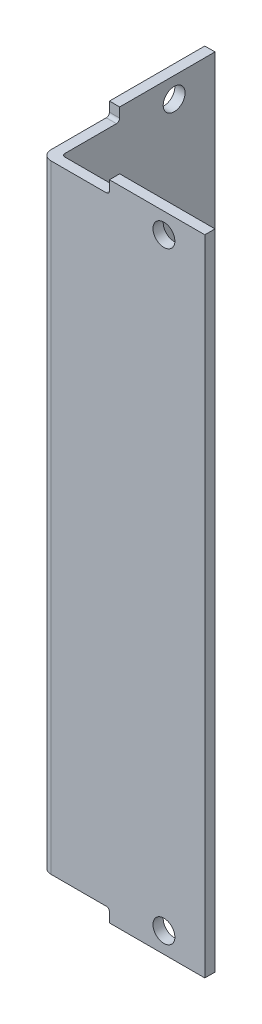
ISO-10303-21;
HEADER;
FILE_DESCRIPTION(('STEP AP214'),'2;1');
FILE_NAME('part.step','',(''),(''),'','','');
FILE_SCHEMA(('AUTOMOTIVE_DESIGN { 1 0 10303 214 1 1 1 1 }'));
ENDSEC;
DATA;
#1=APPLICATION_CONTEXT('core data for automotive mechanical design processes');
#2=APPLICATION_PROTOCOL_DEFINITION('international standard','automotive_design',2000,#1);
#3=PRODUCT_CONTEXT('',#1,'mechanical');
#4=PRODUCT('Part','Part','',(#3));
#5=PRODUCT_RELATED_PRODUCT_CATEGORY('part','',(#4));
#6=PRODUCT_DEFINITION_FORMATION('','',#4);
#7=PRODUCT_DEFINITION_CONTEXT('part definition',#1,'design');
#8=PRODUCT_DEFINITION('design','',#6,#7);
#9=PRODUCT_DEFINITION_SHAPE('','',#8);
#10=(LENGTH_UNIT() NAMED_UNIT(*) SI_UNIT(.MILLI.,.METRE.));
#11=(NAMED_UNIT(*) PLANE_ANGLE_UNIT() SI_UNIT($,.RADIAN.));
#12=(NAMED_UNIT(*) SI_UNIT($,.STERADIAN.) SOLID_ANGLE_UNIT());
#13=UNCERTAINTY_MEASURE_WITH_UNIT(LENGTH_MEASURE(1.E-05),#10,'distance_accuracy_value','');
#14=(GEOMETRIC_REPRESENTATION_CONTEXT(3) GLOBAL_UNCERTAINTY_ASSIGNED_CONTEXT((#13)) GLOBAL_UNIT_ASSIGNED_CONTEXT((#10,
#11,#12)) REPRESENTATION_CONTEXT('',''));
#15=CARTESIAN_POINT('',(0.,0.,0.));
#16=DIRECTION('',(0.,0.,1.));
#17=DIRECTION('',(1.,0.,0.));
#18=AXIS2_PLACEMENT_3D('',#15,#16,#17);
#19=CARTESIAN_POINT('',(-12.7,56.75,12.7));
#20=DIRECTION('',(1.,0.,0.));
#21=DIRECTION('',(0.,0.,-1.));
#22=AXIS2_PLACEMENT_3D('',#19,#20,#21);
#23=PLANE('',#22);
#24=CARTESIAN_POINT('',(-12.7,47.075,-6.35));
#25=DIRECTION('',(-1.,0.,0.));
#26=DIRECTION('',(0.,0.,1.));
#27=AXIS2_PLACEMENT_3D('',#24,#25,#26);
#28=CIRCLE('',#27,1.69999999999999);
#29=CARTESIAN_POINT('',(-12.7,47.075,-4.65));
#30=VERTEX_POINT('',#29);
#31=EDGE_CURVE('E260',#30,#30,#28,.T.);
#32=ORIENTED_EDGE('',*,*,#31,.F.);
#33=EDGE_LOOP('',(#32));
#34=FACE_BOUND('',#33,.T.);
#35=CARTESIAN_POINT('',(-12.7,-46.575,-6.35));
#36=DIRECTION('',(-1.,0.,0.));
#37=DIRECTION('',(0.,0.,1.));
#38=AXIS2_PLACEMENT_3D('',#35,#36,#37);
#39=CIRCLE('',#38,1.69999999999999);
#40=CARTESIAN_POINT('',(-12.7,-46.575,-4.65));
#41=VERTEX_POINT('',#40);
#42=EDGE_CURVE('E239',#41,#41,#39,.T.);
#43=ORIENTED_EDGE('',*,*,#42,.F.);
#44=EDGE_LOOP('',(#43));
#45=FACE_BOUND('',#44,.T.);
#46=DIRECTION('',(0.,-1.,0.));
#47=VECTOR('',#46,1.);
#48=CARTESIAN_POINT('',(-12.7,-47.75,2.1125));
#49=LINE('',#48,#47);
#50=CARTESIAN_POINT('',(-12.7,-48.25,2.1125));
#51=VERTEX_POINT('',#50);
#52=CARTESIAN_POINT('',(-12.7,-49.75,2.1125));
#53=VERTEX_POINT('',#52);
#54=EDGE_CURVE('E202',#51,#53,#49,.T.);
#55=ORIENTED_EDGE('',*,*,#54,.F.);
#56=CARTESIAN_POINT('',(-12.7,-48.25,2.6125));
#57=DIRECTION('',(1.,0.,0.));
#58=DIRECTION('',(0.,0.,-1.));
#59=AXIS2_PLACEMENT_3D('',#56,#57,#58);
#60=CIRCLE('',#59,0.5);
#61=CARTESIAN_POINT('',(-12.7,-47.75,2.6125));
#62=VERTEX_POINT('',#61);
#63=EDGE_CURVE('E52',#51,#62,#60,.T.);
#64=ORIENTED_EDGE('',*,*,#63,.T.);
#65=DIRECTION('',(0.,0.,1.));
#66=VECTOR('',#65,1.);
#67=CARTESIAN_POINT('',(-12.7,-47.75,12.7));
#68=LINE('',#67,#66);
#69=CARTESIAN_POINT('',(-12.7,-47.75,11.2));
#70=VERTEX_POINT('',#69);
#71=EDGE_CURVE('E211',#62,#70,#68,.T.);
#72=ORIENTED_EDGE('',*,*,#71,.T.);
#73=DIRECTION('',(0.,-1.,0.));
#74=VECTOR('',#73,1.);
#75=CARTESIAN_POINT('',(-12.7,56.75,11.2));
#76=LINE('',#75,#74);
#77=CARTESIAN_POINT('',(-12.7,48.250000046,11.2));
#78=VERTEX_POINT('',#77);
#79=EDGE_CURVE('E300',#70,#78,#76,.F.);
#80=ORIENTED_EDGE('',*,*,#79,.T.);
#81=DIRECTION('',(0.,0.,1.));
#82=VECTOR('',#81,1.);
#83=CARTESIAN_POINT('',(-12.7,48.250000046,12.7));
#84=LINE('',#83,#82);
#85=CARTESIAN_POINT('',(-12.7,48.250000046,2.6125));
#86=VERTEX_POINT('',#85);
#87=EDGE_CURVE('E372',#86,#78,#84,.T.);
#88=ORIENTED_EDGE('',*,*,#87,.F.);
#89=CARTESIAN_POINT('',(-12.7,48.750000046,2.6125));
#90=DIRECTION('',(1.,0.,0.));
#91=DIRECTION('',(0.,0.,-1.));
#92=AXIS2_PLACEMENT_3D('',#89,#90,#91);
#93=CIRCLE('',#92,0.5);
#94=CARTESIAN_POINT('',(-12.7,48.750000046,2.1125));
#95=VERTEX_POINT('',#94);
#96=EDGE_CURVE('E326',#86,#95,#93,.T.);
#97=ORIENTED_EDGE('',*,*,#96,.T.);
#98=DIRECTION('',(0.,1.,0.));
#99=VECTOR('',#98,1.);
#100=CARTESIAN_POINT('',(-12.7,48.250000046,2.1125));
#101=LINE('',#100,#99);
#102=CARTESIAN_POINT('',(-12.7,50.250000046,2.1125));
#103=VERTEX_POINT('',#102);
#104=EDGE_CURVE('E383',#95,#103,#101,.T.);
#105=ORIENTED_EDGE('',*,*,#104,.T.);
#106=DIRECTION('',(0.,0.,1.));
#107=VECTOR('',#106,1.);
#108=CARTESIAN_POINT('',(-12.7,50.250000046,-12.7));
#109=LINE('',#108,#107);
#110=CARTESIAN_POINT('',(-12.7,50.250000046,-12.7));
#111=VERTEX_POINT('',#110);
#112=EDGE_CURVE('E231',#111,#103,#109,.T.);
#113=ORIENTED_EDGE('',*,*,#112,.F.);
#114=DIRECTION('',(0.,-1.,0.));
#115=VECTOR('',#114,1.);
#116=CARTESIAN_POINT('',(-12.7,56.75,-12.7));
#117=LINE('',#116,#115);
#118=CARTESIAN_POINT('',(-12.7,-49.75,-12.7));
#119=VERTEX_POINT('',#118);
#120=EDGE_CURVE('E282',#111,#119,#117,.T.);
#121=ORIENTED_EDGE('',*,*,#120,.T.);
#122=DIRECTION('',(0.,0.,-1.));
#123=VECTOR('',#122,1.);
#124=CARTESIAN_POINT('',(-12.7,-49.75,-12.7));
#125=LINE('',#124,#123);
#126=EDGE_CURVE('E244',#53,#119,#125,.T.);
#127=ORIENTED_EDGE('',*,*,#126,.F.);
#128=EDGE_LOOP('',(#55,#64,#72,#80,#88,#97,#105,#113,#121,#127));
#129=FACE_BOUND('',#128,.T.);
#130=ADVANCED_FACE('F44',(#34,#45,#129),#23,.F.);
#131=CARTESIAN_POINT('',(-12.7,56.75,12.7));
#132=DIRECTION('',(0.,0.,-1.));
#133=DIRECTION('',(-1.,0.,0.));
#134=AXIS2_PLACEMENT_3D('',#131,#132,#133);
#135=PLANE('',#134);
#136=CARTESIAN_POINT('',(6.34999999999999,47.075,12.7));
#137=DIRECTION('',(0.,0.,1.));
#138=DIRECTION('',(1.,0.,0.));
#139=AXIS2_PLACEMENT_3D('',#136,#137,#138);
#140=CIRCLE('',#139,1.7);
#141=CARTESIAN_POINT('',(8.04999999999999,47.075,12.7));
#142=VERTEX_POINT('',#141);
#143=EDGE_CURVE('E266',#142,#142,#140,.T.);
#144=ORIENTED_EDGE('',*,*,#143,.F.);
#145=EDGE_LOOP('',(#144));
#146=FACE_BOUND('',#145,.T.);
#147=CARTESIAN_POINT('',(6.34999999999999,-46.575,12.7));
#148=DIRECTION('',(0.,0.,1.));
#149=DIRECTION('',(1.,0.,0.));
#150=AXIS2_PLACEMENT_3D('',#147,#148,#149);
#151=CIRCLE('',#150,1.7);
#152=CARTESIAN_POINT('',(8.04999999999999,-46.575,12.7));
#153=VERTEX_POINT('',#152);
#154=EDGE_CURVE('E254',#153,#153,#151,.T.);
#155=ORIENTED_EDGE('',*,*,#154,.F.);
#156=EDGE_LOOP('',(#155));
#157=FACE_BOUND('',#156,.T.);
#158=DIRECTION('',(1.,0.,0.));
#159=VECTOR('',#158,1.);
#160=CARTESIAN_POINT('',(-12.7,-47.75,12.7));
#161=LINE('',#160,#159);
#162=CARTESIAN_POINT('',(-11.2,-47.75,12.7));
#163=VERTEX_POINT('',#162);
#164=CARTESIAN_POINT('',(-2.6125,-47.75,12.7));
#165=VERTEX_POINT('',#164);
#166=EDGE_CURVE('E354',#163,#165,#161,.T.);
#167=ORIENTED_EDGE('',*,*,#166,.T.);
#168=CARTESIAN_POINT('',(-2.6125,-48.25,12.7));
#169=DIRECTION('',(0.,0.,-1.));
#170=DIRECTION('',(-1.,0.,0.));
#171=AXIS2_PLACEMENT_3D('',#168,#169,#170);
#172=CIRCLE('',#171,0.5);
#173=CARTESIAN_POINT('',(-2.1125,-48.25,12.7));
#174=VERTEX_POINT('',#173);
#175=EDGE_CURVE('E197',#165,#174,#172,.T.);
#176=ORIENTED_EDGE('',*,*,#175,.T.);
#177=DIRECTION('',(0.,-1.,0.));
#178=VECTOR('',#177,1.);
#179=CARTESIAN_POINT('',(-2.1125,-47.75,12.7));
#180=LINE('',#179,#178);
#181=CARTESIAN_POINT('',(-2.1125,-49.75,12.7));
#182=VERTEX_POINT('',#181);
#183=EDGE_CURVE('E189',#174,#182,#180,.T.);
#184=ORIENTED_EDGE('',*,*,#183,.T.);
#185=DIRECTION('',(-1.,0.,0.));
#186=VECTOR('',#185,1.);
#187=CARTESIAN_POINT('',(12.7,-49.75,12.7));
#188=LINE('',#187,#186);
#189=CARTESIAN_POINT('',(12.7,-49.75,12.7));
#190=VERTEX_POINT('',#189);
#191=EDGE_CURVE('E195',#190,#182,#188,.T.);
#192=ORIENTED_EDGE('',*,*,#191,.F.);
#193=DIRECTION('',(0.,-1.,0.));
#194=VECTOR('',#193,1.);
#195=CARTESIAN_POINT('',(12.7,56.75,12.7));
#196=LINE('',#195,#194);
#197=CARTESIAN_POINT('',(12.7,50.25,12.7));
#198=VERTEX_POINT('',#197);
#199=EDGE_CURVE('E277',#198,#190,#196,.T.);
#200=ORIENTED_EDGE('',*,*,#199,.F.);
#201=DIRECTION('',(1.,0.,0.));
#202=VECTOR('',#201,1.);
#203=CARTESIAN_POINT('',(12.7,50.25,12.7));
#204=LINE('',#203,#202);
#205=CARTESIAN_POINT('',(-2.1125,50.25,12.7));
#206=VERTEX_POINT('',#205);
#207=EDGE_CURVE('E399',#206,#198,#204,.T.);
#208=ORIENTED_EDGE('',*,*,#207,.F.);
#209=DIRECTION('',(0.,1.,0.));
#210=VECTOR('',#209,1.);
#211=CARTESIAN_POINT('',(-2.1125,48.250000046,12.7));
#212=LINE('',#211,#210);
#213=CARTESIAN_POINT('',(-2.1125,48.750000046,12.7));
#214=VERTEX_POINT('',#213);
#215=EDGE_CURVE('E379',#214,#206,#212,.T.);
#216=ORIENTED_EDGE('',*,*,#215,.F.);
#217=CARTESIAN_POINT('',(-2.6125,48.750000046,12.7));
#218=DIRECTION('',(0.,0.,-1.));
#219=DIRECTION('',(-1.,0.,0.));
#220=AXIS2_PLACEMENT_3D('',#217,#218,#219);
#221=CIRCLE('',#220,0.5);
#222=CARTESIAN_POINT('',(-2.6125,48.250000046,12.7));
#223=VERTEX_POINT('',#222);
#224=EDGE_CURVE('E323',#214,#223,#221,.T.);
#225=ORIENTED_EDGE('',*,*,#224,.T.);
#226=DIRECTION('',(1.,0.,0.));
#227=VECTOR('',#226,1.);
#228=CARTESIAN_POINT('',(-12.7,48.250000046,12.7));
#229=LINE('',#228,#227);
#230=CARTESIAN_POINT('',(-11.2,48.250000046,12.7));
#231=VERTEX_POINT('',#230);
#232=EDGE_CURVE('E375',#231,#223,#229,.T.);
#233=ORIENTED_EDGE('',*,*,#232,.F.);
#234=DIRECTION('',(0.,-1.,0.));
#235=VECTOR('',#234,1.);
#236=CARTESIAN_POINT('',(-11.2,56.75,12.7));
#237=LINE('',#236,#235);
#238=EDGE_CURVE('E293',#231,#163,#237,.T.);
#239=ORIENTED_EDGE('',*,*,#238,.T.);
#240=EDGE_LOOP('',(#167,#176,#184,#192,#200,#208,#216,#225,#233,#239));
#241=FACE_BOUND('',#240,.T.);
#242=ADVANCED_FACE('F192',(#146,#157,#241),#135,.F.);
#243=CARTESIAN_POINT('',(12.7,-56.75,11.1125));
#244=DIRECTION('',(0.,0.,1.));
#245=DIRECTION('',(1.,0.,0.));
#246=AXIS2_PLACEMENT_3D('',#243,#244,#245);
#247=PLANE('',#246);
#248=CARTESIAN_POINT('',(6.34999999999999,47.075,11.1125));
#249=DIRECTION('',(0.,0.,1.));
#250=DIRECTION('',(1.,0.,0.));
#251=AXIS2_PLACEMENT_3D('',#248,#249,#250);
#252=CIRCLE('',#251,1.69999999999999);
#253=CARTESIAN_POINT('',(8.04999999999999,47.075,11.1125));
#254=VERTEX_POINT('',#253);
#255=EDGE_CURVE('E270',#254,#254,#252,.T.);
#256=ORIENTED_EDGE('',*,*,#255,.T.);
#257=EDGE_LOOP('',(#256));
#258=FACE_BOUND('',#257,.T.);
#259=CARTESIAN_POINT('',(6.34999999999999,-46.575,11.1125));
#260=DIRECTION('',(0.,0.,1.));
#261=DIRECTION('',(1.,0.,0.));
#262=AXIS2_PLACEMENT_3D('',#259,#260,#261);
#263=CIRCLE('',#262,1.69999999999999);
#264=CARTESIAN_POINT('',(8.04999999999999,-46.575,11.1125));
#265=VERTEX_POINT('',#264);
#266=EDGE_CURVE('E257',#265,#265,#263,.T.);
#267=ORIENTED_EDGE('',*,*,#266,.T.);
#268=EDGE_LOOP('',(#267));
#269=FACE_BOUND('',#268,.T.);
#270=DIRECTION('',(0.,-1.,0.));
#271=VECTOR('',#270,1.);
#272=CARTESIAN_POINT('',(-2.1125,-56.75,11.1125));
#273=LINE('',#272,#271);
#274=CARTESIAN_POINT('',(-2.1125,-48.25,11.1125));
#275=VERTEX_POINT('',#274);
#276=CARTESIAN_POINT('',(-2.1125,-49.75,11.1125));
#277=VERTEX_POINT('',#276);
#278=EDGE_CURVE('E208',#275,#277,#273,.T.);
#279=ORIENTED_EDGE('',*,*,#278,.F.);
#280=CARTESIAN_POINT('',(-2.6125,-48.25,11.1125));
#281=DIRECTION('',(0.,0.,1.));
#282=DIRECTION('',(1.,0.,0.));
#283=AXIS2_PLACEMENT_3D('',#280,#281,#282);
#284=CIRCLE('',#283,0.5);
#285=CARTESIAN_POINT('',(-2.6125,-47.75,11.1125));
#286=VERTEX_POINT('',#285);
#287=EDGE_CURVE('E343',#275,#286,#284,.T.);
#288=ORIENTED_EDGE('',*,*,#287,.T.);
#289=DIRECTION('',(-1.,0.,0.));
#290=VECTOR('',#289,1.);
#291=CARTESIAN_POINT('',(12.7,-47.75,11.1125));
#292=LINE('',#291,#290);
#293=CARTESIAN_POINT('',(-10.6045,-47.75,11.1125));
#294=VERTEX_POINT('',#293);
#295=EDGE_CURVE('E369',#286,#294,#292,.T.);
#296=ORIENTED_EDGE('',*,*,#295,.T.);
#297=DIRECTION('',(0.,1.,0.));
#298=VECTOR('',#297,1.);
#299=CARTESIAN_POINT('',(-10.6045,56.75,11.1125));
#300=LINE('',#299,#298);
#301=CARTESIAN_POINT('',(-10.6045,48.250000046,11.1125));
#302=VERTEX_POINT('',#301);
#303=EDGE_CURVE('E286',#294,#302,#300,.T.);
#304=ORIENTED_EDGE('',*,*,#303,.T.);
#305=DIRECTION('',(1.,0.,0.));
#306=VECTOR('',#305,1.);
#307=CARTESIAN_POINT('',(12.7,48.250000046,11.1125));
#308=LINE('',#307,#306);
#309=CARTESIAN_POINT('',(-2.6125,48.250000046,11.1125));
#310=VERTEX_POINT('',#309);
#311=EDGE_CURVE('E217',#302,#310,#308,.T.);
#312=ORIENTED_EDGE('',*,*,#311,.T.);
#313=CARTESIAN_POINT('',(-2.6125,48.750000046,11.1125));
#314=DIRECTION('',(0.,0.,1.));
#315=DIRECTION('',(1.,0.,0.));
#316=AXIS2_PLACEMENT_3D('',#313,#314,#315);
#317=CIRCLE('',#316,0.5);
#318=CARTESIAN_POINT('',(-2.1125,48.750000046,11.1125));
#319=VERTEX_POINT('',#318);
#320=EDGE_CURVE('E320',#310,#319,#317,.T.);
#321=ORIENTED_EDGE('',*,*,#320,.T.);
#322=DIRECTION('',(0.,1.,0.));
#323=VECTOR('',#322,1.);
#324=CARTESIAN_POINT('',(-2.1125,-56.75,11.1125));
#325=LINE('',#324,#323);
#326=CARTESIAN_POINT('',(-2.1125,50.250000046,11.1125));
#327=VERTEX_POINT('',#326);
#328=EDGE_CURVE('E385',#319,#327,#325,.T.);
#329=ORIENTED_EDGE('',*,*,#328,.T.);
#330=DIRECTION('',(-1.,0.,0.));
#331=VECTOR('',#330,1.);
#332=CARTESIAN_POINT('',(12.7,50.25,11.1125));
#333=LINE('',#332,#331);
#334=CARTESIAN_POINT('',(12.7,50.25,11.1125));
#335=VERTEX_POINT('',#334);
#336=EDGE_CURVE('E230',#335,#327,#333,.T.);
#337=ORIENTED_EDGE('',*,*,#336,.F.);
#338=DIRECTION('',(0.,1.,0.));
#339=VECTOR('',#338,1.);
#340=CARTESIAN_POINT('',(12.7,-56.75,11.1125));
#341=LINE('',#340,#339);
#342=CARTESIAN_POINT('',(12.7,-49.75,11.1125));
#343=VERTEX_POINT('',#342);
#344=EDGE_CURVE('E275',#343,#335,#341,.T.);
#345=ORIENTED_EDGE('',*,*,#344,.F.);
#346=DIRECTION('',(1.,0.,0.));
#347=VECTOR('',#346,1.);
#348=CARTESIAN_POINT('',(12.7,-49.75,11.1125));
#349=LINE('',#348,#347);
#350=EDGE_CURVE('E219',#277,#343,#349,.T.);
#351=ORIENTED_EDGE('',*,*,#350,.F.);
#352=EDGE_LOOP('',(#279,#288,#296,#304,#312,#321,#329,#337,#345,#351));
#353=FACE_BOUND('',#352,.T.);
#354=ADVANCED_FACE('F423',(#258,#269,#353),#247,.F.);
#355=CARTESIAN_POINT('',(-11.1125,-56.75,-12.7));
#356=DIRECTION('',(-1.,0.,0.));
#357=DIRECTION('',(0.,0.,1.));
#358=AXIS2_PLACEMENT_3D('',#355,#356,#357);
#359=PLANE('',#358);
#360=CARTESIAN_POINT('',(-11.1125,47.075,-6.35));
#361=DIRECTION('',(-1.,0.,0.));
#362=DIRECTION('',(0.,0.,1.));
#363=AXIS2_PLACEMENT_3D('',#360,#361,#362);
#364=CIRCLE('',#363,1.69999999999999);
#365=CARTESIAN_POINT('',(-11.1125,47.075,-4.65));
#366=VERTEX_POINT('',#365);
#367=EDGE_CURVE('E263',#366,#366,#364,.T.);
#368=ORIENTED_EDGE('',*,*,#367,.T.);
#369=EDGE_LOOP('',(#368));
#370=FACE_BOUND('',#369,.T.);
#371=CARTESIAN_POINT('',(-11.1125,-46.575,-6.35));
#372=DIRECTION('',(-1.,0.,0.));
#373=DIRECTION('',(0.,0.,1.));
#374=AXIS2_PLACEMENT_3D('',#371,#372,#373);
#375=CIRCLE('',#374,1.69999999999999);
#376=CARTESIAN_POINT('',(-11.1125,-46.575,-4.65));
#377=VERTEX_POINT('',#376);
#378=EDGE_CURVE('E253',#377,#377,#375,.T.);
#379=ORIENTED_EDGE('',*,*,#378,.T.);
#380=EDGE_LOOP('',(#379));
#381=FACE_BOUND('',#380,.T.);
#382=DIRECTION('',(0.,1.,0.));
#383=VECTOR('',#382,1.);
#384=CARTESIAN_POINT('',(-11.1125,-56.75,2.1125));
#385=LINE('',#384,#383);
#386=CARTESIAN_POINT('',(-11.1125,-49.75,2.1125));
#387=VERTEX_POINT('',#386);
#388=CARTESIAN_POINT('',(-11.1125,-48.25,2.1125));
#389=VERTEX_POINT('',#388);
#390=EDGE_CURVE('E201',#387,#389,#385,.T.);
#391=ORIENTED_EDGE('',*,*,#390,.F.);
#392=DIRECTION('',(0.,0.,1.));
#393=VECTOR('',#392,1.);
#394=CARTESIAN_POINT('',(-11.1125,-49.75,-12.7));
#395=LINE('',#394,#393);
#396=CARTESIAN_POINT('',(-11.1125,-49.75,-12.7));
#397=VERTEX_POINT('',#396);
#398=EDGE_CURVE('E240',#397,#387,#395,.T.);
#399=ORIENTED_EDGE('',*,*,#398,.F.);
#400=DIRECTION('',(0.,1.,0.));
#401=VECTOR('',#400,1.);
#402=CARTESIAN_POINT('',(-11.1125,-56.75,-12.7));
#403=LINE('',#402,#401);
#404=CARTESIAN_POINT('',(-11.1125,50.250000046,-12.7));
#405=VERTEX_POINT('',#404);
#406=EDGE_CURVE('E274',#397,#405,#403,.T.);
#407=ORIENTED_EDGE('',*,*,#406,.T.);
#408=DIRECTION('',(0.,0.,-1.));
#409=VECTOR('',#408,1.);
#410=CARTESIAN_POINT('',(-11.1125,50.250000046,-12.7));
#411=LINE('',#410,#409);
#412=CARTESIAN_POINT('',(-11.1125,50.250000046,2.1125));
#413=VERTEX_POINT('',#412);
#414=EDGE_CURVE('E237',#413,#405,#411,.T.);
#415=ORIENTED_EDGE('',*,*,#414,.F.);
#416=DIRECTION('',(0.,-1.,0.));
#417=VECTOR('',#416,1.);
#418=CARTESIAN_POINT('',(-11.1125,-56.75,2.1125));
#419=LINE('',#418,#417);
#420=CARTESIAN_POINT('',(-11.1125,48.750000046,2.1125));
#421=VERTEX_POINT('',#420);
#422=EDGE_CURVE('E390',#413,#421,#419,.T.);
#423=ORIENTED_EDGE('',*,*,#422,.T.);
#424=CARTESIAN_POINT('',(-11.1125,48.750000046,2.6125));
#425=DIRECTION('',(-1.,0.,0.));
#426=DIRECTION('',(0.,0.,1.));
#427=AXIS2_PLACEMENT_3D('',#424,#425,#426);
#428=CIRCLE('',#427,0.5);
#429=CARTESIAN_POINT('',(-11.1125,48.250000046,2.6125));
#430=VERTEX_POINT('',#429);
#431=EDGE_CURVE('E328',#421,#430,#428,.T.);
#432=ORIENTED_EDGE('',*,*,#431,.T.);
#433=DIRECTION('',(0.,0.,1.));
#434=VECTOR('',#433,1.);
#435=CARTESIAN_POINT('',(-11.1125,48.250000046,-12.7));
#436=LINE('',#435,#434);
#437=CARTESIAN_POINT('',(-11.1125,48.250000046,10.6045));
#438=VERTEX_POINT('',#437);
#439=EDGE_CURVE('E223',#430,#438,#436,.T.);
#440=ORIENTED_EDGE('',*,*,#439,.T.);
#441=DIRECTION('',(0.,1.,0.));
#442=VECTOR('',#441,1.);
#443=CARTESIAN_POINT('',(-11.1125,-56.75,10.6045));
#444=LINE('',#443,#442);
#445=CARTESIAN_POINT('',(-11.1125,-47.75,10.6045));
#446=VERTEX_POINT('',#445);
#447=EDGE_CURVE('E289',#438,#446,#444,.F.);
#448=ORIENTED_EDGE('',*,*,#447,.T.);
#449=DIRECTION('',(0.,0.,-1.));
#450=VECTOR('',#449,1.);
#451=CARTESIAN_POINT('',(-11.1125,-47.75,-12.7));
#452=LINE('',#451,#450);
#453=CARTESIAN_POINT('',(-11.1125,-47.75,2.6125));
#454=VERTEX_POINT('',#453);
#455=EDGE_CURVE('E367',#446,#454,#452,.T.);
#456=ORIENTED_EDGE('',*,*,#455,.T.);
#457=CARTESIAN_POINT('',(-11.1125,-48.25,2.6125));
#458=DIRECTION('',(-1.,0.,0.));
#459=DIRECTION('',(0.,0.,1.));
#460=AXIS2_PLACEMENT_3D('',#457,#458,#459);
#461=CIRCLE('',#460,0.5);
#462=EDGE_CURVE('E11',#454,#389,#461,.T.);
#463=ORIENTED_EDGE('',*,*,#462,.T.);
#464=EDGE_LOOP('',(#391,#399,#407,#415,#423,#432,#440,#448,#456,#463));
#465=FACE_BOUND('',#464,.T.);
#466=ADVANCED_FACE('F452',(#370,#381,#465),#359,.F.);
#467=CARTESIAN_POINT('',(12.701,-49.75,-12.7));
#468=DIRECTION('',(0.,1.,0.));
#469=DIRECTION('',(0.,0.,1.));
#470=AXIS2_PLACEMENT_3D('',#467,#468,#469);
#471=PLANE('',#470);
#472=DIRECTION('',(0.,0.,-1.));
#473=VECTOR('',#472,1.);
#474=CARTESIAN_POINT('',(-2.1125,-49.75,12.7));
#475=LINE('',#474,#473);
#476=EDGE_CURVE('E205',#182,#277,#475,.T.);
#477=ORIENTED_EDGE('',*,*,#476,.T.);
#478=ORIENTED_EDGE('',*,*,#350,.T.);
#479=DIRECTION('',(0.,0.,1.));
#480=VECTOR('',#479,1.);
#481=CARTESIAN_POINT('',(12.7,-49.75,-12.701));
#482=LINE('',#481,#480);
#483=EDGE_CURVE('E216',#343,#190,#482,.T.);
#484=ORIENTED_EDGE('',*,*,#483,.T.);
#485=ORIENTED_EDGE('',*,*,#191,.T.);
#486=EDGE_LOOP('',(#477,#478,#484,#485));
#487=FACE_BOUND('',#486,.T.);
#488=ADVANCED_FACE('F214',(#487),#471,.F.);
#489=DIRECTION('',(1.,0.,0.));
#490=VECTOR('',#489,1.);
#491=CARTESIAN_POINT('',(12.701,-49.75,2.1125));
#492=LINE('',#491,#490);
#493=EDGE_CURVE('E330',#53,#387,#492,.T.);
#494=ORIENTED_EDGE('',*,*,#493,.F.);
#495=ORIENTED_EDGE('',*,*,#126,.T.);
#496=DIRECTION('',(-1.,0.,0.));
#497=VECTOR('',#496,1.);
#498=CARTESIAN_POINT('',(12.701,-49.75,-12.7));
#499=LINE('',#498,#497);
#500=EDGE_CURVE('E235',#397,#119,#499,.T.);
#501=ORIENTED_EDGE('',*,*,#500,.F.);
#502=ORIENTED_EDGE('',*,*,#398,.T.);
#503=EDGE_LOOP('',(#494,#495,#501,#502));
#504=FACE_BOUND('',#503,.T.);
#505=ADVANCED_FACE('F451',(#504),#471,.F.);
#506=CARTESIAN_POINT('',(12.701,50.250000046,-12.7));
#507=DIRECTION('',(0.,-1.,0.));
#508=DIRECTION('',(0.,0.,-1.));
#509=AXIS2_PLACEMENT_3D('',#506,#507,#508);
#510=PLANE('',#509);
#511=ORIENTED_EDGE('',*,*,#112,.T.);
#512=DIRECTION('',(1.,0.,0.));
#513=VECTOR('',#512,1.);
#514=CARTESIAN_POINT('',(12.701,50.250000046,2.1125));
#515=LINE('',#514,#513);
#516=EDGE_CURVE('E303',#103,#413,#515,.T.);
#517=ORIENTED_EDGE('',*,*,#516,.T.);
#518=ORIENTED_EDGE('',*,*,#414,.T.);
#519=DIRECTION('',(-1.,0.,0.));
#520=VECTOR('',#519,1.);
#521=CARTESIAN_POINT('',(12.701,50.250000046,-12.7));
#522=LINE('',#521,#520);
#523=EDGE_CURVE('E234',#405,#111,#522,.T.);
#524=ORIENTED_EDGE('',*,*,#523,.T.);
#525=EDGE_LOOP('',(#511,#517,#518,#524));
#526=FACE_BOUND('',#525,.T.);
#527=ADVANCED_FACE('F444',(#526),#510,.F.);
#528=CARTESIAN_POINT('',(12.7,56.75,12.7));
#529=DIRECTION('',(-1.,0.,0.));
#530=DIRECTION('',(0.,0.,1.));
#531=AXIS2_PLACEMENT_3D('',#528,#529,#530);
#532=PLANE('',#531);
#533=ORIENTED_EDGE('',*,*,#344,.T.);
#534=DIRECTION('',(0.,0.,1.));
#535=VECTOR('',#534,1.);
#536=CARTESIAN_POINT('',(12.7,50.25,-12.701));
#537=LINE('',#536,#535);
#538=EDGE_CURVE('E226',#335,#198,#537,.T.);
#539=ORIENTED_EDGE('',*,*,#538,.T.);
#540=ORIENTED_EDGE('',*,*,#199,.T.);
#541=ORIENTED_EDGE('',*,*,#483,.F.);
#542=EDGE_LOOP('',(#533,#539,#540,#541));
#543=FACE_BOUND('',#542,.T.);
#544=ADVANCED_FACE('F407',(#543),#532,.F.);
#545=CARTESIAN_POINT('',(-12.7,56.75,-12.7));
#546=DIRECTION('',(0.,0.,1.));
#547=DIRECTION('',(1.,0.,0.));
#548=AXIS2_PLACEMENT_3D('',#545,#546,#547);
#549=PLANE('',#548);
#550=ORIENTED_EDGE('',*,*,#523,.F.);
#551=ORIENTED_EDGE('',*,*,#406,.F.);
#552=ORIENTED_EDGE('',*,*,#500,.T.);
#553=ORIENTED_EDGE('',*,*,#120,.F.);
#554=EDGE_LOOP('',(#550,#551,#552,#553));
#555=FACE_BOUND('',#554,.T.);
#556=ADVANCED_FACE('F448',(#555),#549,.F.);
#557=CARTESIAN_POINT('',(-10.6045,-56.75,10.6045));
#558=DIRECTION('',(0.,-1.,0.));
#559=DIRECTION('',(0.,0.,-1.));
#560=AXIS2_PLACEMENT_3D('',#557,#558,#559);
#561=CYLINDRICAL_SURFACE('',#560,0.508);
#562=ORIENTED_EDGE('',*,*,#303,.F.);
#563=CARTESIAN_POINT('',(-10.6045,-47.75,10.6045));
#564=DIRECTION('',(0.,1.,0.));
#565=DIRECTION('',(0.,0.,1.));
#566=AXIS2_PLACEMENT_3D('',#563,#564,#565);
#567=CIRCLE('',#566,0.508);
#568=EDGE_CURVE('E361',#294,#446,#567,.F.);
#569=ORIENTED_EDGE('',*,*,#568,.T.);
#570=ORIENTED_EDGE('',*,*,#447,.F.);
#571=CARTESIAN_POINT('',(-10.6045,48.250000046,10.6045));
#572=DIRECTION('',(0.,-1.,0.));
#573=DIRECTION('',(0.,0.,-1.));
#574=AXIS2_PLACEMENT_3D('',#571,#572,#573);
#575=CIRCLE('',#574,0.508);
#576=EDGE_CURVE('E393',#438,#302,#575,.F.);
#577=ORIENTED_EDGE('',*,*,#576,.T.);
#578=EDGE_LOOP('',(#562,#569,#570,#577));
#579=FACE_BOUND('',#578,.T.);
#580=ADVANCED_FACE('F428',(#579),#561,.F.);
#581=CARTESIAN_POINT('',(6.34999999999999,47.075,12.7));
#582=DIRECTION('',(0.,0.,1.));
#583=DIRECTION('',(1.,0.,0.));
#584=AXIS2_PLACEMENT_3D('',#581,#582,#583);
#585=CYLINDRICAL_SURFACE('',#584,1.69999999999999);
#586=ORIENTED_EDGE('',*,*,#143,.T.);
#587=EDGE_LOOP('',(#586));
#588=FACE_BOUND('',#587,.T.);
#589=ORIENTED_EDGE('',*,*,#255,.F.);
#590=EDGE_LOOP('',(#589));
#591=FACE_BOUND('',#590,.T.);
#592=ADVANCED_FACE('F481',(#588,#591),#585,.F.);
#593=CARTESIAN_POINT('',(-12.7,47.075,-6.35));
#594=DIRECTION('',(-1.,0.,0.));
#595=DIRECTION('',(0.,0.,1.));
#596=AXIS2_PLACEMENT_3D('',#593,#594,#595);
#597=CYLINDRICAL_SURFACE('',#596,1.69999999999999);
#598=ORIENTED_EDGE('',*,*,#31,.T.);
#599=EDGE_LOOP('',(#598));
#600=FACE_BOUND('',#599,.T.);
#601=ORIENTED_EDGE('',*,*,#367,.F.);
#602=EDGE_LOOP('',(#601));
#603=FACE_BOUND('',#602,.T.);
#604=ADVANCED_FACE('F517',(#600,#603),#597,.F.);
#605=CARTESIAN_POINT('',(6.34999999999999,-46.575,12.7));
#606=DIRECTION('',(0.,0.,1.));
#607=DIRECTION('',(1.,0.,0.));
#608=AXIS2_PLACEMENT_3D('',#605,#606,#607);
#609=CYLINDRICAL_SURFACE('',#608,1.69999999999999);
#610=ORIENTED_EDGE('',*,*,#154,.T.);
#611=EDGE_LOOP('',(#610));
#612=FACE_BOUND('',#611,.T.);
#613=ORIENTED_EDGE('',*,*,#266,.F.);
#614=EDGE_LOOP('',(#613));
#615=FACE_BOUND('',#614,.T.);
#616=ADVANCED_FACE('F513',(#612,#615),#609,.F.);
#617=CARTESIAN_POINT('',(-12.7,-46.575,-6.35));
#618=DIRECTION('',(-1.,0.,0.));
#619=DIRECTION('',(0.,0.,1.));
#620=AXIS2_PLACEMENT_3D('',#617,#618,#619);
#621=CYLINDRICAL_SURFACE('',#620,1.69999999999999);
#622=ORIENTED_EDGE('',*,*,#42,.T.);
#623=EDGE_LOOP('',(#622));
#624=FACE_BOUND('',#623,.T.);
#625=ORIENTED_EDGE('',*,*,#378,.F.);
#626=EDGE_LOOP('',(#625));
#627=FACE_BOUND('',#626,.T.);
#628=ADVANCED_FACE('F486',(#624,#627),#621,.F.);
#629=CARTESIAN_POINT('',(-11.2,56.75,11.2));
#630=DIRECTION('',(0.,-1.,0.));
#631=DIRECTION('',(0.,0.,-1.));
#632=AXIS2_PLACEMENT_3D('',#629,#630,#631);
#633=CYLINDRICAL_SURFACE('',#632,1.5);
#634=CARTESIAN_POINT('',(-11.2,-47.75,11.2));
#635=DIRECTION('',(0.,1.,0.));
#636=DIRECTION('',(0.,0.,1.));
#637=AXIS2_PLACEMENT_3D('',#634,#635,#636);
#638=CIRCLE('',#637,1.5);
#639=EDGE_CURVE('E332',#163,#70,#638,.F.);
#640=ORIENTED_EDGE('',*,*,#639,.F.);
#641=ORIENTED_EDGE('',*,*,#238,.F.);
#642=CARTESIAN_POINT('',(-11.2,48.250000046,11.2));
#643=DIRECTION('',(0.,-1.,0.));
#644=DIRECTION('',(0.,0.,-1.));
#645=AXIS2_PLACEMENT_3D('',#642,#643,#644);
#646=CIRCLE('',#645,1.5);
#647=EDGE_CURVE('E306',#78,#231,#646,.F.);
#648=ORIENTED_EDGE('',*,*,#647,.F.);
#649=ORIENTED_EDGE('',*,*,#79,.F.);
#650=EDGE_LOOP('',(#640,#641,#648,#649));
#651=FACE_BOUND('',#650,.T.);
#652=ADVANCED_FACE('F482',(#651),#633,.T.);
#653=ORIENTED_EDGE('',*,*,#336,.T.);
#654=DIRECTION('',(0.,0.,-1.));
#655=VECTOR('',#654,1.);
#656=CARTESIAN_POINT('',(-2.1125,50.250000046,12.7));
#657=LINE('',#656,#655);
#658=EDGE_CURVE('E371',#206,#327,#657,.T.);
#659=ORIENTED_EDGE('',*,*,#658,.F.);
#660=ORIENTED_EDGE('',*,*,#207,.T.);
#661=ORIENTED_EDGE('',*,*,#538,.F.);
#662=EDGE_LOOP('',(#653,#659,#660,#661));
#663=FACE_BOUND('',#662,.T.);
#664=ADVANCED_FACE('F485',(#663),#510,.F.);
#665=CARTESIAN_POINT('',(0.,48.250000046,0.));
#666=DIRECTION('',(0.,-1.,0.));
#667=DIRECTION('',(0.,0.,-1.));
#668=AXIS2_PLACEMENT_3D('',#665,#666,#667);
#669=PLANE('',#668);
#670=ORIENTED_EDGE('',*,*,#232,.T.);
#671=DIRECTION('',(0.,0.,-1.));
#672=VECTOR('',#671,1.);
#673=CARTESIAN_POINT('',(-2.6125,48.250000046,11.1125));
#674=LINE('',#673,#672);
#675=EDGE_CURVE('E311',#223,#310,#674,.T.);
#676=ORIENTED_EDGE('',*,*,#675,.T.);
#677=ORIENTED_EDGE('',*,*,#311,.F.);
#678=ORIENTED_EDGE('',*,*,#576,.F.);
#679=ORIENTED_EDGE('',*,*,#439,.F.);
#680=DIRECTION('',(-1.,0.,0.));
#681=VECTOR('',#680,1.);
#682=CARTESIAN_POINT('',(-12.7,48.250000046,2.6125));
#683=LINE('',#682,#681);
#684=EDGE_CURVE('E308',#430,#86,#683,.T.);
#685=ORIENTED_EDGE('',*,*,#684,.T.);
#686=ORIENTED_EDGE('',*,*,#87,.T.);
#687=ORIENTED_EDGE('',*,*,#647,.T.);
#688=EDGE_LOOP('',(#670,#676,#677,#678,#679,#685,#686,#687));
#689=FACE_BOUND('',#688,.T.);
#690=ADVANCED_FACE('F420',(#689),#669,.F.);
#691=CARTESIAN_POINT('',(-12.7,48.250000046,2.1125));
#692=DIRECTION('',(0.,0.,-1.));
#693=DIRECTION('',(-1.,0.,0.));
#694=AXIS2_PLACEMENT_3D('',#691,#692,#693);
#695=PLANE('',#694);
#696=ORIENTED_EDGE('',*,*,#104,.F.);
#697=DIRECTION('',(-1.,0.,0.));
#698=VECTOR('',#697,1.);
#699=CARTESIAN_POINT('',(-11.1125,48.750000046,2.1125));
#700=LINE('',#699,#698);
#701=EDGE_CURVE('E318',#95,#421,#700,.F.);
#702=ORIENTED_EDGE('',*,*,#701,.T.);
#703=ORIENTED_EDGE('',*,*,#422,.F.);
#704=ORIENTED_EDGE('',*,*,#516,.F.);
#705=EDGE_LOOP('',(#696,#702,#703,#704));
#706=FACE_BOUND('',#705,.T.);
#707=ADVANCED_FACE('F441',(#706),#695,.F.);
#708=CARTESIAN_POINT('',(-2.1125,48.250000046,12.7));
#709=DIRECTION('',(1.,0.,0.));
#710=DIRECTION('',(0.,0.,-1.));
#711=AXIS2_PLACEMENT_3D('',#708,#709,#710);
#712=PLANE('',#711);
#713=ORIENTED_EDGE('',*,*,#328,.F.);
#714=DIRECTION('',(0.,0.,-1.));
#715=VECTOR('',#714,1.);
#716=CARTESIAN_POINT('',(-2.1125,48.750000046,12.7));
#717=LINE('',#716,#715);
#718=EDGE_CURVE('E315',#319,#214,#717,.F.);
#719=ORIENTED_EDGE('',*,*,#718,.T.);
#720=ORIENTED_EDGE('',*,*,#215,.T.);
#721=ORIENTED_EDGE('',*,*,#658,.T.);
#722=EDGE_LOOP('',(#713,#719,#720,#721));
#723=FACE_BOUND('',#722,.T.);
#724=ADVANCED_FACE('F490',(#723),#712,.F.);
#725=CARTESIAN_POINT('',(-2.6125,48.750000046,0.));
#726=DIRECTION('',(0.,0.,1.));
#727=DIRECTION('',(1.,0.,0.));
#728=AXIS2_PLACEMENT_3D('',#725,#726,#727);
#729=CYLINDRICAL_SURFACE('',#728,0.5);
#730=ORIENTED_EDGE('',*,*,#224,.F.);
#731=ORIENTED_EDGE('',*,*,#718,.F.);
#732=ORIENTED_EDGE('',*,*,#320,.F.);
#733=ORIENTED_EDGE('',*,*,#675,.F.);
#734=EDGE_LOOP('',(#730,#731,#732,#733));
#735=FACE_BOUND('',#734,.T.);
#736=ADVANCED_FACE('F417',(#735),#729,.F.);
#737=CARTESIAN_POINT('',(0.,48.750000046,2.6125));
#738=DIRECTION('',(1.,0.,0.));
#739=DIRECTION('',(0.,0.,-1.));
#740=AXIS2_PLACEMENT_3D('',#737,#738,#739);
#741=CYLINDRICAL_SURFACE('',#740,0.5);
#742=ORIENTED_EDGE('',*,*,#431,.F.);
#743=ORIENTED_EDGE('',*,*,#701,.F.);
#744=ORIENTED_EDGE('',*,*,#96,.F.);
#745=ORIENTED_EDGE('',*,*,#684,.F.);
#746=EDGE_LOOP('',(#742,#743,#744,#745));
#747=FACE_BOUND('',#746,.T.);
#748=ADVANCED_FACE('F435',(#747),#741,.F.);
#749=CARTESIAN_POINT('',(0.,-47.75,0.));
#750=DIRECTION('',(0.,1.,0.));
#751=DIRECTION('',(0.,0.,-1.));
#752=AXIS2_PLACEMENT_3D('',#749,#750,#751);
#753=PLANE('',#752);
#754=ORIENTED_EDGE('',*,*,#295,.F.);
#755=DIRECTION('',(0.,0.,-1.));
#756=VECTOR('',#755,1.);
#757=CARTESIAN_POINT('',(-2.6125,-47.75,0.));
#758=LINE('',#757,#756);
#759=EDGE_CURVE('E339',#286,#165,#758,.F.);
#760=ORIENTED_EDGE('',*,*,#759,.T.);
#761=ORIENTED_EDGE('',*,*,#166,.F.);
#762=ORIENTED_EDGE('',*,*,#639,.T.);
#763=ORIENTED_EDGE('',*,*,#71,.F.);
#764=DIRECTION('',(-1.,0.,0.));
#765=VECTOR('',#764,1.);
#766=CARTESIAN_POINT('',(0.,-47.75,2.6125));
#767=LINE('',#766,#765);
#768=EDGE_CURVE('E337',#62,#454,#767,.F.);
#769=ORIENTED_EDGE('',*,*,#768,.T.);
#770=ORIENTED_EDGE('',*,*,#455,.F.);
#771=ORIENTED_EDGE('',*,*,#568,.F.);
#772=EDGE_LOOP('',(#754,#760,#761,#762,#763,#769,#770,#771));
#773=FACE_BOUND('',#772,.T.);
#774=ADVANCED_FACE('F351',(#773),#753,.F.);
#775=CARTESIAN_POINT('',(-2.1125,-47.75,12.7));
#776=DIRECTION('',(-1.,0.,0.));
#777=DIRECTION('',(0.,0.,1.));
#778=AXIS2_PLACEMENT_3D('',#775,#776,#777);
#779=PLANE('',#778);
#780=ORIENTED_EDGE('',*,*,#183,.F.);
#781=DIRECTION('',(0.,0.,-1.));
#782=VECTOR('',#781,1.);
#783=CARTESIAN_POINT('',(-2.1125,-48.25,12.7));
#784=LINE('',#783,#782);
#785=EDGE_CURVE('E335',#174,#275,#784,.T.);
#786=ORIENTED_EDGE('',*,*,#785,.T.);
#787=ORIENTED_EDGE('',*,*,#278,.T.);
#788=ORIENTED_EDGE('',*,*,#476,.F.);
#789=EDGE_LOOP('',(#780,#786,#787,#788));
#790=FACE_BOUND('',#789,.T.);
#791=ADVANCED_FACE('F206',(#790),#779,.T.);
#792=CARTESIAN_POINT('',(-12.7,-47.75,2.1125));
#793=DIRECTION('',(0.,0.,1.));
#794=DIRECTION('',(1.,0.,0.));
#795=AXIS2_PLACEMENT_3D('',#792,#793,#794);
#796=PLANE('',#795);
#797=ORIENTED_EDGE('',*,*,#390,.T.);
#798=DIRECTION('',(-1.,0.,0.));
#799=VECTOR('',#798,1.);
#800=CARTESIAN_POINT('',(-12.7,-48.25,2.1125));
#801=LINE('',#800,#799);
#802=EDGE_CURVE('E341',#389,#51,#801,.T.);
#803=ORIENTED_EDGE('',*,*,#802,.T.);
#804=ORIENTED_EDGE('',*,*,#54,.T.);
#805=ORIENTED_EDGE('',*,*,#493,.T.);
#806=EDGE_LOOP('',(#797,#803,#804,#805));
#807=FACE_BOUND('',#806,.T.);
#808=ADVANCED_FACE('F357',(#807),#796,.T.);
#809=CARTESIAN_POINT('',(-2.6125,-48.25,12.7));
#810=DIRECTION('',(0.,0.,-1.));
#811=DIRECTION('',(-1.,0.,0.));
#812=AXIS2_PLACEMENT_3D('',#809,#810,#811);
#813=CYLINDRICAL_SURFACE('',#812,0.5);
#814=ORIENTED_EDGE('',*,*,#175,.F.);
#815=ORIENTED_EDGE('',*,*,#759,.F.);
#816=ORIENTED_EDGE('',*,*,#287,.F.);
#817=ORIENTED_EDGE('',*,*,#785,.F.);
#818=EDGE_LOOP('',(#814,#815,#816,#817));
#819=FACE_BOUND('',#818,.T.);
#820=ADVANCED_FACE('F492',(#819),#813,.F.);
#821=CARTESIAN_POINT('',(-12.7,-48.25,2.6125));
#822=DIRECTION('',(-1.,0.,0.));
#823=DIRECTION('',(0.,0.,1.));
#824=AXIS2_PLACEMENT_3D('',#821,#822,#823);
#825=CYLINDRICAL_SURFACE('',#824,0.5);
#826=ORIENTED_EDGE('',*,*,#462,.F.);
#827=ORIENTED_EDGE('',*,*,#768,.F.);
#828=ORIENTED_EDGE('',*,*,#63,.F.);
#829=ORIENTED_EDGE('',*,*,#802,.F.);
#830=EDGE_LOOP('',(#826,#827,#828,#829));
#831=FACE_BOUND('',#830,.T.);
#832=ADVANCED_FACE('F46',(#831),#825,.F.);
#833=CLOSED_SHELL('',(#130,#242,#354,#466,#488,#505,#527,#544,#556,#580,#592,#604,#616,#628,
#652,#664,#690,#707,#724,#736,#748,#774,#791,#808,#820,#832));
#834=MANIFOLD_SOLID_BREP('B2',#833);
#835=ADVANCED_BREP_SHAPE_REPRESENTATION('',(#18,#834),#14);
#836=SHAPE_DEFINITION_REPRESENTATION(#9,#835);
ENDSEC;
END-ISO-10303-21;
